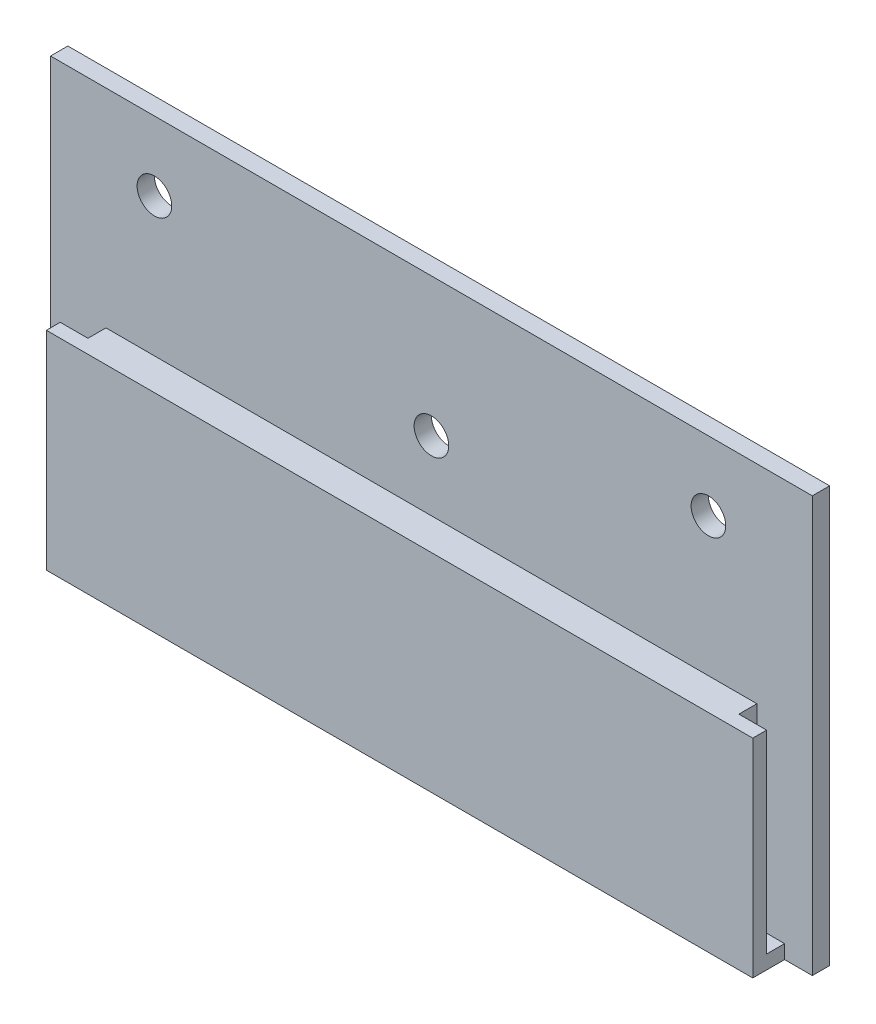
ISO-10303-21;
HEADER;
FILE_DESCRIPTION(('STEP AP214'),'2;1');
FILE_NAME('part.step','',(''),(''),'','','');
FILE_SCHEMA(('AUTOMOTIVE_DESIGN { 1 0 10303 214 1 1 1 1 }'));
ENDSEC;
DATA;
#1=APPLICATION_CONTEXT('core data for automotive mechanical design processes');
#2=APPLICATION_PROTOCOL_DEFINITION('international standard','automotive_design',2000,#1);
#3=PRODUCT_CONTEXT('',#1,'mechanical');
#4=PRODUCT('Part','Part','',(#3));
#5=PRODUCT_RELATED_PRODUCT_CATEGORY('part','',(#4));
#6=PRODUCT_DEFINITION_FORMATION('','',#4);
#7=PRODUCT_DEFINITION_CONTEXT('part definition',#1,'design');
#8=PRODUCT_DEFINITION('design','',#6,#7);
#9=PRODUCT_DEFINITION_SHAPE('','',#8);
#10=(LENGTH_UNIT() NAMED_UNIT(*) SI_UNIT(.MILLI.,.METRE.));
#11=(NAMED_UNIT(*) PLANE_ANGLE_UNIT() SI_UNIT($,.RADIAN.));
#12=(NAMED_UNIT(*) SI_UNIT($,.STERADIAN.) SOLID_ANGLE_UNIT());
#13=UNCERTAINTY_MEASURE_WITH_UNIT(LENGTH_MEASURE(1.E-05),#10,'distance_accuracy_value','');
#14=(GEOMETRIC_REPRESENTATION_CONTEXT(3) GLOBAL_UNCERTAINTY_ASSIGNED_CONTEXT((#13)) GLOBAL_UNIT_ASSIGNED_CONTEXT((#10,
#11,#12)) REPRESENTATION_CONTEXT('',''));
#15=CARTESIAN_POINT('',(0.,0.,0.));
#16=DIRECTION('',(0.,0.,1.));
#17=DIRECTION('',(1.,0.,0.));
#18=AXIS2_PLACEMENT_3D('',#15,#16,#17);
#19=CARTESIAN_POINT('',(10.16,-76.2,6.477));
#20=DIRECTION('',(1.,0.,0.));
#21=DIRECTION('',(0.,0.,-1.));
#22=AXIS2_PLACEMENT_3D('',#19,#20,#21);
#23=PLANE('',#22);
#24=DIRECTION('',(0.,0.,-1.));
#25=VECTOR('',#24,1.);
#26=CARTESIAN_POINT('',(10.16,-73.66,6.477));
#27=LINE('',#26,#25);
#28=CARTESIAN_POINT('',(10.16,-73.66,6.477));
#29=VERTEX_POINT('',#28);
#30=CARTESIAN_POINT('',(10.16,-73.66,3.175));
#31=VERTEX_POINT('',#30);
#32=EDGE_CURVE('E254',#29,#31,#27,.T.);
#33=ORIENTED_EDGE('',*,*,#32,.F.);
#34=DIRECTION('',(0.,-1.,0.));
#35=VECTOR('',#34,1.);
#36=CARTESIAN_POINT('',(10.16,-76.2,6.477));
#37=LINE('',#36,#35);
#38=CARTESIAN_POINT('',(10.16,-38.1,6.477));
#39=VERTEX_POINT('',#38);
#40=EDGE_CURVE('E223',#39,#29,#37,.T.);
#41=ORIENTED_EDGE('',*,*,#40,.F.);
#42=DIRECTION('',(0.,0.,-1.));
#43=VECTOR('',#42,1.);
#44=CARTESIAN_POINT('',(10.16,-38.1,6.477));
#45=LINE('',#44,#43);
#46=CARTESIAN_POINT('',(10.16,-38.1,3.175));
#47=VERTEX_POINT('',#46);
#48=EDGE_CURVE('E217',#39,#47,#45,.T.);
#49=ORIENTED_EDGE('',*,*,#48,.T.);
#50=DIRECTION('',(0.,-1.,0.));
#51=VECTOR('',#50,1.);
#52=CARTESIAN_POINT('',(10.16,-76.2,3.175));
#53=LINE('',#52,#51);
#54=EDGE_CURVE('E66',#47,#31,#53,.T.);
#55=ORIENTED_EDGE('',*,*,#54,.T.);
#56=EDGE_LOOP('',(#33,#41,#49,#55));
#57=FACE_BOUND('',#56,.T.);
#58=ADVANCED_FACE('F49',(#57),#23,.F.);
#59=CARTESIAN_POINT('',(129.54,-76.2,6.477));
#60=DIRECTION('',(-1.,0.,0.));
#61=DIRECTION('',(0.,0.,1.));
#62=AXIS2_PLACEMENT_3D('',#59,#60,#61);
#63=PLANE('',#62);
#64=DIRECTION('',(0.,0.,1.));
#65=VECTOR('',#64,1.);
#66=CARTESIAN_POINT('',(129.54,-73.66,6.477));
#67=LINE('',#66,#65);
#68=CARTESIAN_POINT('',(129.54,-73.66,3.175));
#69=VERTEX_POINT('',#68);
#70=CARTESIAN_POINT('',(129.54,-73.66,6.477));
#71=VERTEX_POINT('',#70);
#72=EDGE_CURVE('E260',#69,#71,#67,.T.);
#73=ORIENTED_EDGE('',*,*,#72,.F.);
#74=DIRECTION('',(0.,1.,0.));
#75=VECTOR('',#74,1.);
#76=CARTESIAN_POINT('',(129.54,-76.2,3.175));
#77=LINE('',#76,#75);
#78=CARTESIAN_POINT('',(129.54,-38.1,3.175));
#79=VERTEX_POINT('',#78);
#80=EDGE_CURVE('E224',#69,#79,#77,.T.);
#81=ORIENTED_EDGE('',*,*,#80,.T.);
#82=DIRECTION('',(0.,0.,-1.));
#83=VECTOR('',#82,1.);
#84=CARTESIAN_POINT('',(129.54,-38.1,6.477));
#85=LINE('',#84,#83);
#86=CARTESIAN_POINT('',(129.54,-38.1,6.477));
#87=VERTEX_POINT('',#86);
#88=EDGE_CURVE('E198',#87,#79,#85,.T.);
#89=ORIENTED_EDGE('',*,*,#88,.F.);
#90=DIRECTION('',(0.,1.,0.));
#91=VECTOR('',#90,1.);
#92=CARTESIAN_POINT('',(129.54,-76.2,6.477));
#93=LINE('',#92,#91);
#94=EDGE_CURVE('E220',#71,#87,#93,.T.);
#95=ORIENTED_EDGE('',*,*,#94,.F.);
#96=EDGE_LOOP('',(#73,#81,#89,#95));
#97=FACE_BOUND('',#96,.T.);
#98=ADVANCED_FACE('F321',(#97),#63,.F.);
#99=CARTESIAN_POINT('',(0.,0.,6.477));
#100=DIRECTION('',(0.,0.,1.));
#101=DIRECTION('',(1.,0.,0.));
#102=AXIS2_PLACEMENT_3D('',#99,#100,#101);
#103=PLANE('',#102);
#104=DIRECTION('',(1.,0.,0.));
#105=VECTOR('',#104,1.);
#106=CARTESIAN_POINT('',(0.,-73.66,6.477));
#107=LINE('',#106,#105);
#108=CARTESIAN_POINT('',(5.08,-73.66,6.477));
#109=VERTEX_POINT('',#108);
#110=EDGE_CURVE('E256',#109,#29,#107,.T.);
#111=ORIENTED_EDGE('',*,*,#110,.F.);
#112=DIRECTION('',(0.,-1.,0.));
#113=VECTOR('',#112,1.);
#114=CARTESIAN_POINT('',(5.07999999999999,-38.1,6.477));
#115=LINE('',#114,#113);
#116=CARTESIAN_POINT('',(5.07999999999999,-38.1,6.477));
#117=VERTEX_POINT('',#116);
#118=EDGE_CURVE('E179',#117,#109,#115,.T.);
#119=ORIENTED_EDGE('',*,*,#118,.F.);
#120=DIRECTION('',(-1.,0.,0.));
#121=VECTOR('',#120,1.);
#122=CARTESIAN_POINT('',(5.07999999999999,-38.1,6.477));
#123=LINE('',#122,#121);
#124=EDGE_CURVE('E242',#39,#117,#123,.T.);
#125=ORIENTED_EDGE('',*,*,#124,.F.);
#126=ORIENTED_EDGE('',*,*,#40,.T.);
#127=EDGE_LOOP('',(#111,#119,#125,#126));
#128=FACE_BOUND('',#127,.T.);
#129=ADVANCED_FACE('F328',(#128),#103,.F.);
#130=DIRECTION('',(1.,0.,0.));
#131=VECTOR('',#130,1.);
#132=CARTESIAN_POINT('',(0.,-73.66,6.477));
#133=LINE('',#132,#131);
#134=CARTESIAN_POINT('',(134.62,-73.66,6.477));
#135=VERTEX_POINT('',#134);
#136=EDGE_CURVE('E262',#71,#135,#133,.T.);
#137=ORIENTED_EDGE('',*,*,#136,.F.);
#138=ORIENTED_EDGE('',*,*,#94,.T.);
#139=CARTESIAN_POINT('',(134.62,-38.1,6.477));
#140=VERTEX_POINT('',#139);
#141=EDGE_CURVE('E238',#140,#87,#123,.T.);
#142=ORIENTED_EDGE('',*,*,#141,.F.);
#143=DIRECTION('',(0.,1.,0.));
#144=VECTOR('',#143,1.);
#145=CARTESIAN_POINT('',(134.62,-38.1,6.477));
#146=LINE('',#145,#144);
#147=EDGE_CURVE('E243',#135,#140,#146,.T.);
#148=ORIENTED_EDGE('',*,*,#147,.F.);
#149=EDGE_LOOP('',(#137,#138,#142,#148));
#150=FACE_BOUND('',#149,.T.);
#151=ADVANCED_FACE('F298',(#150),#103,.F.);
#152=CARTESIAN_POINT('',(0.,0.,3.175));
#153=DIRECTION('',(0.,0.,-1.));
#154=DIRECTION('',(-1.,0.,0.));
#155=AXIS2_PLACEMENT_3D('',#152,#153,#154);
#156=PLANE('',#155);
#157=CARTESIAN_POINT('',(19.05,-12.7,3.175));
#158=DIRECTION('',(0.,0.,-1.));
#159=DIRECTION('',(-1.,0.,0.));
#160=AXIS2_PLACEMENT_3D('',#157,#158,#159);
#161=CIRCLE('',#160,3.175);
#162=CARTESIAN_POINT('',(15.875,-12.7,3.175));
#163=VERTEX_POINT('',#162);
#164=EDGE_CURVE('E268',#163,#163,#161,.T.);
#165=ORIENTED_EDGE('',*,*,#164,.T.);
#166=EDGE_LOOP('',(#165));
#167=FACE_BOUND('',#166,.T.);
#168=CARTESIAN_POINT('',(69.85,-25.4,3.175));
#169=DIRECTION('',(0.,0.,-1.));
#170=DIRECTION('',(-1.,0.,0.));
#171=AXIS2_PLACEMENT_3D('',#168,#169,#170);
#172=CIRCLE('',#171,3.175);
#173=CARTESIAN_POINT('',(66.675,-25.4,3.175));
#174=VERTEX_POINT('',#173);
#175=EDGE_CURVE('E271',#174,#174,#172,.T.);
#176=ORIENTED_EDGE('',*,*,#175,.T.);
#177=EDGE_LOOP('',(#176));
#178=FACE_BOUND('',#177,.T.);
#179=CARTESIAN_POINT('',(120.65,-12.7,3.175));
#180=DIRECTION('',(0.,0.,-1.));
#181=DIRECTION('',(-1.,0.,0.));
#182=AXIS2_PLACEMENT_3D('',#179,#180,#181);
#183=CIRCLE('',#182,3.17499999999998);
#184=CARTESIAN_POINT('',(117.475,-12.7,3.175));
#185=VERTEX_POINT('',#184);
#186=EDGE_CURVE('E274',#185,#185,#183,.T.);
#187=ORIENTED_EDGE('',*,*,#186,.T.);
#188=EDGE_LOOP('',(#187));
#189=FACE_BOUND('',#188,.T.);
#190=DIRECTION('',(-1.,0.,0.));
#191=VECTOR('',#190,1.);
#192=CARTESIAN_POINT('',(0.,-73.66,3.175));
#193=LINE('',#192,#191);
#194=CARTESIAN_POINT('',(134.62,-73.66,3.175));
#195=VERTEX_POINT('',#194);
#196=EDGE_CURVE('E258',#195,#69,#193,.T.);
#197=ORIENTED_EDGE('',*,*,#196,.F.);
#198=DIRECTION('',(0.,-1.,0.));
#199=VECTOR('',#198,1.);
#200=CARTESIAN_POINT('',(134.62,0.,3.175));
#201=LINE('',#200,#199);
#202=CARTESIAN_POINT('',(134.62,-76.2,3.175));
#203=VERTEX_POINT('',#202);
#204=EDGE_CURVE('E180',#195,#203,#201,.T.);
#205=ORIENTED_EDGE('',*,*,#204,.T.);
#206=DIRECTION('',(1.,0.,0.));
#207=VECTOR('',#206,1.);
#208=CARTESIAN_POINT('',(0.,-76.2,3.175));
#209=LINE('',#208,#207);
#210=CARTESIAN_POINT('',(139.7,-76.2,3.175));
#211=VERTEX_POINT('',#210);
#212=EDGE_CURVE('E187',#203,#211,#209,.T.);
#213=ORIENTED_EDGE('',*,*,#212,.T.);
#214=DIRECTION('',(0.,-1.,0.));
#215=VECTOR('',#214,1.);
#216=CARTESIAN_POINT('',(139.7,0.,3.175));
#217=LINE('',#216,#215);
#218=CARTESIAN_POINT('',(139.7,0.,3.175));
#219=VERTEX_POINT('',#218);
#220=EDGE_CURVE('E190',#219,#211,#217,.T.);
#221=ORIENTED_EDGE('',*,*,#220,.F.);
#222=DIRECTION('',(1.,0.,0.));
#223=VECTOR('',#222,1.);
#224=CARTESIAN_POINT('',(0.,0.,3.175));
#225=LINE('',#224,#223);
#226=CARTESIAN_POINT('',(0.,0.,3.175));
#227=VERTEX_POINT('',#226);
#228=EDGE_CURVE('E204',#227,#219,#225,.T.);
#229=ORIENTED_EDGE('',*,*,#228,.F.);
#230=DIRECTION('',(0.,-1.,0.));
#231=VECTOR('',#230,1.);
#232=CARTESIAN_POINT('',(0.,0.,3.175));
#233=LINE('',#232,#231);
#234=CARTESIAN_POINT('',(0.,-76.2,3.175));
#235=VERTEX_POINT('',#234);
#236=EDGE_CURVE('E185',#227,#235,#233,.T.);
#237=ORIENTED_EDGE('',*,*,#236,.T.);
#238=CARTESIAN_POINT('',(5.08,-76.2,3.175));
#239=VERTEX_POINT('',#238);
#240=EDGE_CURVE('E166',#235,#239,#209,.T.);
#241=ORIENTED_EDGE('',*,*,#240,.T.);
#242=DIRECTION('',(0.,1.,0.));
#243=VECTOR('',#242,1.);
#244=CARTESIAN_POINT('',(5.08,0.,3.175));
#245=LINE('',#244,#243);
#246=CARTESIAN_POINT('',(5.08,-73.66,3.175));
#247=VERTEX_POINT('',#246);
#248=EDGE_CURVE('E175',#239,#247,#245,.T.);
#249=ORIENTED_EDGE('',*,*,#248,.T.);
#250=EDGE_CURVE('E253',#31,#247,#193,.T.);
#251=ORIENTED_EDGE('',*,*,#250,.F.);
#252=ORIENTED_EDGE('',*,*,#54,.F.);
#253=DIRECTION('',(-1.,0.,0.));
#254=VECTOR('',#253,1.);
#255=CARTESIAN_POINT('',(10.16,-38.1,3.175));
#256=LINE('',#255,#254);
#257=EDGE_CURVE('E221',#79,#47,#256,.T.);
#258=ORIENTED_EDGE('',*,*,#257,.F.);
#259=ORIENTED_EDGE('',*,*,#80,.F.);
#260=EDGE_LOOP('',(#197,#205,#213,#221,#229,#237,#241,#249,#251,#252,#258,#259));
#261=FACE_BOUND('',#260,.T.);
#262=ADVANCED_FACE('F183',(#167,#178,#189,#261),#156,.F.);
#263=CARTESIAN_POINT('',(0.,0.,3.175));
#264=DIRECTION('',(0.,1.,0.));
#265=DIRECTION('',(0.,0.,1.));
#266=AXIS2_PLACEMENT_3D('',#263,#264,#265);
#267=PLANE('',#266);
#268=DIRECTION('',(1.,0.,0.));
#269=VECTOR('',#268,1.);
#270=CARTESIAN_POINT('',(0.,0.,0.));
#271=LINE('',#270,#269);
#272=CARTESIAN_POINT('',(0.,0.,0.));
#273=VERTEX_POINT('',#272);
#274=CARTESIAN_POINT('',(139.7,0.,0.));
#275=VERTEX_POINT('',#274);
#276=EDGE_CURVE('E194',#273,#275,#271,.T.);
#277=ORIENTED_EDGE('',*,*,#276,.F.);
#278=DIRECTION('',(0.,0.,-1.));
#279=VECTOR('',#278,1.);
#280=CARTESIAN_POINT('',(0.,0.,3.175));
#281=LINE('',#280,#279);
#282=EDGE_CURVE('E11',#227,#273,#281,.T.);
#283=ORIENTED_EDGE('',*,*,#282,.F.);
#284=ORIENTED_EDGE('',*,*,#228,.T.);
#285=DIRECTION('',(0.,0.,-1.));
#286=VECTOR('',#285,1.);
#287=CARTESIAN_POINT('',(139.7,0.,3.175));
#288=LINE('',#287,#286);
#289=EDGE_CURVE('E53',#219,#275,#288,.T.);
#290=ORIENTED_EDGE('',*,*,#289,.T.);
#291=EDGE_LOOP('',(#277,#283,#284,#290));
#292=FACE_BOUND('',#291,.T.);
#293=ADVANCED_FACE('F51',(#292),#267,.T.);
#294=CARTESIAN_POINT('',(0.,0.,3.175));
#295=DIRECTION('',(1.,0.,0.));
#296=DIRECTION('',(0.,0.,-1.));
#297=AXIS2_PLACEMENT_3D('',#294,#295,#296);
#298=PLANE('',#297);
#299=DIRECTION('',(0.,-1.,0.));
#300=VECTOR('',#299,1.);
#301=CARTESIAN_POINT('',(0.,0.,0.));
#302=LINE('',#301,#300);
#303=CARTESIAN_POINT('',(0.,-76.2,0.));
#304=VERTEX_POINT('',#303);
#305=EDGE_CURVE('E203',#273,#304,#302,.T.);
#306=ORIENTED_EDGE('',*,*,#305,.T.);
#307=DIRECTION('',(0.,0.,-1.));
#308=VECTOR('',#307,1.);
#309=CARTESIAN_POINT('',(0.,-76.2,3.175));
#310=LINE('',#309,#308);
#311=EDGE_CURVE('E58',#235,#304,#310,.T.);
#312=ORIENTED_EDGE('',*,*,#311,.F.);
#313=ORIENTED_EDGE('',*,*,#236,.F.);
#314=ORIENTED_EDGE('',*,*,#282,.T.);
#315=EDGE_LOOP('',(#306,#312,#313,#314));
#316=FACE_BOUND('',#315,.T.);
#317=ADVANCED_FACE('F213',(#316),#298,.F.);
#318=CARTESIAN_POINT('',(0.,-76.2,3.175));
#319=DIRECTION('',(0.,1.,0.));
#320=DIRECTION('',(0.,0.,1.));
#321=AXIS2_PLACEMENT_3D('',#318,#319,#320);
#322=PLANE('',#321);
#323=ORIENTED_EDGE('',*,*,#212,.F.);
#324=DIRECTION('',(0.,0.,-1.));
#325=VECTOR('',#324,1.);
#326=CARTESIAN_POINT('',(134.62,-76.2,9.017));
#327=LINE('',#326,#325);
#328=CARTESIAN_POINT('',(134.62,-76.2,9.017));
#329=VERTEX_POINT('',#328);
#330=EDGE_CURVE('E171',#329,#203,#327,.T.);
#331=ORIENTED_EDGE('',*,*,#330,.F.);
#332=DIRECTION('',(1.,0.,0.));
#333=VECTOR('',#332,1.);
#334=CARTESIAN_POINT('',(5.08,-76.2,9.017));
#335=LINE('',#334,#333);
#336=CARTESIAN_POINT('',(5.08,-76.2,9.017));
#337=VERTEX_POINT('',#336);
#338=EDGE_CURVE('E168',#337,#329,#335,.T.);
#339=ORIENTED_EDGE('',*,*,#338,.F.);
#340=DIRECTION('',(0.,0.,-1.));
#341=VECTOR('',#340,1.);
#342=CARTESIAN_POINT('',(5.08,-76.2,9.017));
#343=LINE('',#342,#341);
#344=EDGE_CURVE('E160',#337,#239,#343,.T.);
#345=ORIENTED_EDGE('',*,*,#344,.T.);
#346=ORIENTED_EDGE('',*,*,#240,.F.);
#347=ORIENTED_EDGE('',*,*,#311,.T.);
#348=DIRECTION('',(1.,0.,0.));
#349=VECTOR('',#348,1.);
#350=CARTESIAN_POINT('',(0.,-76.2,0.));
#351=LINE('',#350,#349);
#352=CARTESIAN_POINT('',(139.7,-76.2,0.));
#353=VERTEX_POINT('',#352);
#354=EDGE_CURVE('E201',#304,#353,#351,.T.);
#355=ORIENTED_EDGE('',*,*,#354,.T.);
#356=DIRECTION('',(0.,0.,-1.));
#357=VECTOR('',#356,1.);
#358=CARTESIAN_POINT('',(139.7,-76.2,3.175));
#359=LINE('',#358,#357);
#360=EDGE_CURVE('E206',#211,#353,#359,.T.);
#361=ORIENTED_EDGE('',*,*,#360,.F.);
#362=EDGE_LOOP('',(#323,#331,#339,#345,#346,#347,#355,#361));
#363=FACE_BOUND('',#362,.T.);
#364=ADVANCED_FACE('F163',(#363),#322,.F.);
#365=CARTESIAN_POINT('',(139.7,0.,3.175));
#366=DIRECTION('',(1.,0.,0.));
#367=DIRECTION('',(0.,0.,-1.));
#368=AXIS2_PLACEMENT_3D('',#365,#366,#367);
#369=PLANE('',#368);
#370=DIRECTION('',(0.,-1.,0.));
#371=VECTOR('',#370,1.);
#372=CARTESIAN_POINT('',(139.7,0.,0.));
#373=LINE('',#372,#371);
#374=EDGE_CURVE('E197',#275,#353,#373,.T.);
#375=ORIENTED_EDGE('',*,*,#374,.F.);
#376=ORIENTED_EDGE('',*,*,#289,.F.);
#377=ORIENTED_EDGE('',*,*,#220,.T.);
#378=ORIENTED_EDGE('',*,*,#360,.T.);
#379=EDGE_LOOP('',(#375,#376,#377,#378));
#380=FACE_BOUND('',#379,.T.);
#381=ADVANCED_FACE('F209',(#380),#369,.T.);
#382=CARTESIAN_POINT('',(0.,0.,0.));
#383=DIRECTION('',(0.,0.,-1.));
#384=DIRECTION('',(-1.,0.,0.));
#385=AXIS2_PLACEMENT_3D('',#382,#383,#384);
#386=PLANE('',#385);
#387=CARTESIAN_POINT('',(19.05,-12.7,0.));
#388=DIRECTION('',(0.,0.,1.));
#389=DIRECTION('',(1.,0.,0.));
#390=AXIS2_PLACEMENT_3D('',#387,#388,#389);
#391=CIRCLE('',#390,3.175);
#392=CARTESIAN_POINT('',(22.225,-12.7,0.));
#393=VERTEX_POINT('',#392);
#394=EDGE_CURVE('E277',#393,#393,#391,.T.);
#395=ORIENTED_EDGE('',*,*,#394,.T.);
#396=EDGE_LOOP('',(#395));
#397=FACE_BOUND('',#396,.T.);
#398=CARTESIAN_POINT('',(69.85,-25.4,0.));
#399=DIRECTION('',(0.,0.,1.));
#400=DIRECTION('',(1.,0.,0.));
#401=AXIS2_PLACEMENT_3D('',#398,#399,#400);
#402=CIRCLE('',#401,3.175);
#403=CARTESIAN_POINT('',(73.025,-25.4,0.));
#404=VERTEX_POINT('',#403);
#405=EDGE_CURVE('E281',#404,#404,#402,.T.);
#406=ORIENTED_EDGE('',*,*,#405,.T.);
#407=EDGE_LOOP('',(#406));
#408=FACE_BOUND('',#407,.T.);
#409=CARTESIAN_POINT('',(120.65,-12.7,0.));
#410=DIRECTION('',(0.,0.,1.));
#411=DIRECTION('',(1.,0.,0.));
#412=AXIS2_PLACEMENT_3D('',#409,#410,#411);
#413=CIRCLE('',#412,3.17499999999998);
#414=CARTESIAN_POINT('',(123.825,-12.7,0.));
#415=VERTEX_POINT('',#414);
#416=EDGE_CURVE('E278',#415,#415,#413,.T.);
#417=ORIENTED_EDGE('',*,*,#416,.T.);
#418=EDGE_LOOP('',(#417));
#419=FACE_BOUND('',#418,.T.);
#420=ORIENTED_EDGE('',*,*,#374,.T.);
#421=ORIENTED_EDGE('',*,*,#354,.F.);
#422=ORIENTED_EDGE('',*,*,#305,.F.);
#423=ORIENTED_EDGE('',*,*,#276,.T.);
#424=EDGE_LOOP('',(#420,#421,#422,#423));
#425=FACE_BOUND('',#424,.T.);
#426=ADVANCED_FACE('F212',(#397,#408,#419,#425),#386,.T.);
#427=CARTESIAN_POINT('',(10.16,-38.1,6.477));
#428=DIRECTION('',(0.,-1.,0.));
#429=DIRECTION('',(0.,0.,-1.));
#430=AXIS2_PLACEMENT_3D('',#427,#428,#429);
#431=PLANE('',#430);
#432=ORIENTED_EDGE('',*,*,#257,.T.);
#433=ORIENTED_EDGE('',*,*,#48,.F.);
#434=ORIENTED_EDGE('',*,*,#124,.T.);
#435=DIRECTION('',(0.,0.,-1.));
#436=VECTOR('',#435,1.);
#437=CARTESIAN_POINT('',(5.07999999999999,-38.1,9.017));
#438=LINE('',#437,#436);
#439=CARTESIAN_POINT('',(5.07999999999999,-38.1,9.017));
#440=VERTEX_POINT('',#439);
#441=EDGE_CURVE('E234',#440,#117,#438,.T.);
#442=ORIENTED_EDGE('',*,*,#441,.F.);
#443=DIRECTION('',(-1.,0.,0.));
#444=VECTOR('',#443,1.);
#445=CARTESIAN_POINT('',(5.07999999999999,-38.1,9.017));
#446=LINE('',#445,#444);
#447=CARTESIAN_POINT('',(134.62,-38.1,9.017));
#448=VERTEX_POINT('',#447);
#449=EDGE_CURVE('E237',#448,#440,#446,.T.);
#450=ORIENTED_EDGE('',*,*,#449,.F.);
#451=DIRECTION('',(0.,0.,-1.));
#452=VECTOR('',#451,1.);
#453=CARTESIAN_POINT('',(134.62,-38.1,9.017));
#454=LINE('',#453,#452);
#455=EDGE_CURVE('E231',#448,#140,#454,.T.);
#456=ORIENTED_EDGE('',*,*,#455,.T.);
#457=ORIENTED_EDGE('',*,*,#141,.T.);
#458=ORIENTED_EDGE('',*,*,#88,.T.);
#459=EDGE_LOOP('',(#432,#433,#434,#442,#450,#456,#457,#458));
#460=FACE_BOUND('',#459,.T.);
#461=ADVANCED_FACE('F336',(#460),#431,.F.);
#462=CARTESIAN_POINT('',(5.07999999999999,-38.1,9.017));
#463=DIRECTION('',(1.,0.,0.));
#464=DIRECTION('',(0.,1.,0.));
#465=AXIS2_PLACEMENT_3D('',#462,#463,#464);
#466=PLANE('',#465);
#467=ORIENTED_EDGE('',*,*,#344,.F.);
#468=DIRECTION('',(0.,-1.,0.));
#469=VECTOR('',#468,1.);
#470=CARTESIAN_POINT('',(5.07999999999999,-38.1,9.017));
#471=LINE('',#470,#469);
#472=EDGE_CURVE('E241',#440,#337,#471,.T.);
#473=ORIENTED_EDGE('',*,*,#472,.F.);
#474=ORIENTED_EDGE('',*,*,#441,.T.);
#475=ORIENTED_EDGE('',*,*,#118,.T.);
#476=DIRECTION('',(0.,0.,-1.));
#477=VECTOR('',#476,1.);
#478=CARTESIAN_POINT('',(5.08,-73.66,9.017));
#479=LINE('',#478,#477);
#480=EDGE_CURVE('E178',#109,#247,#479,.T.);
#481=ORIENTED_EDGE('',*,*,#480,.T.);
#482=ORIENTED_EDGE('',*,*,#248,.F.);
#483=EDGE_LOOP('',(#467,#473,#474,#475,#481,#482));
#484=FACE_BOUND('',#483,.T.);
#485=ADVANCED_FACE('F176',(#484),#466,.F.);
#486=CARTESIAN_POINT('',(134.62,-38.1,9.017));
#487=DIRECTION('',(-1.,0.,0.));
#488=DIRECTION('',(0.,0.,1.));
#489=AXIS2_PLACEMENT_3D('',#486,#487,#488);
#490=PLANE('',#489);
#491=ORIENTED_EDGE('',*,*,#330,.T.);
#492=ORIENTED_EDGE('',*,*,#204,.F.);
#493=DIRECTION('',(0.,0.,1.));
#494=VECTOR('',#493,1.);
#495=CARTESIAN_POINT('',(134.62,-73.66,9.017));
#496=LINE('',#495,#494);
#497=EDGE_CURVE('E264',#195,#135,#496,.T.);
#498=ORIENTED_EDGE('',*,*,#497,.T.);
#499=ORIENTED_EDGE('',*,*,#147,.T.);
#500=ORIENTED_EDGE('',*,*,#455,.F.);
#501=DIRECTION('',(0.,1.,0.));
#502=VECTOR('',#501,1.);
#503=CARTESIAN_POINT('',(134.62,-38.1,9.017));
#504=LINE('',#503,#502);
#505=EDGE_CURVE('E247',#329,#448,#504,.T.);
#506=ORIENTED_EDGE('',*,*,#505,.F.);
#507=EDGE_LOOP('',(#491,#492,#498,#499,#500,#506));
#508=FACE_BOUND('',#507,.T.);
#509=ADVANCED_FACE('F383',(#508),#490,.F.);
#510=CARTESIAN_POINT('',(0.,0.,9.017));
#511=DIRECTION('',(0.,0.,1.));
#512=DIRECTION('',(1.,0.,0.));
#513=AXIS2_PLACEMENT_3D('',#510,#511,#512);
#514=PLANE('',#513);
#515=ORIENTED_EDGE('',*,*,#505,.T.);
#516=ORIENTED_EDGE('',*,*,#449,.T.);
#517=ORIENTED_EDGE('',*,*,#472,.T.);
#518=ORIENTED_EDGE('',*,*,#338,.T.);
#519=EDGE_LOOP('',(#515,#516,#517,#518));
#520=FACE_BOUND('',#519,.T.);
#521=ADVANCED_FACE('F374',(#520),#514,.T.);
#522=CARTESIAN_POINT('',(0.,-73.66,0.));
#523=DIRECTION('',(0.,-1.,0.));
#524=DIRECTION('',(0.,0.,-1.));
#525=AXIS2_PLACEMENT_3D('',#522,#523,#524);
#526=PLANE('',#525);
#527=ORIENTED_EDGE('',*,*,#497,.F.);
#528=ORIENTED_EDGE('',*,*,#196,.T.);
#529=ORIENTED_EDGE('',*,*,#72,.T.);
#530=ORIENTED_EDGE('',*,*,#136,.T.);
#531=EDGE_LOOP('',(#527,#528,#529,#530));
#532=FACE_BOUND('',#531,.T.);
#533=ADVANCED_FACE('F316',(#532),#526,.F.);
#534=ORIENTED_EDGE('',*,*,#32,.T.);
#535=ORIENTED_EDGE('',*,*,#250,.T.);
#536=ORIENTED_EDGE('',*,*,#480,.F.);
#537=ORIENTED_EDGE('',*,*,#110,.T.);
#538=EDGE_LOOP('',(#534,#535,#536,#537));
#539=FACE_BOUND('',#538,.T.);
#540=ADVANCED_FACE('F306',(#539),#526,.F.);
#541=CARTESIAN_POINT('',(120.65,-12.7,0.));
#542=DIRECTION('',(0.,0.,1.));
#543=DIRECTION('',(1.,0.,0.));
#544=AXIS2_PLACEMENT_3D('',#541,#542,#543);
#545=CYLINDRICAL_SURFACE('',#544,3.17499999999998);
#546=ORIENTED_EDGE('',*,*,#416,.F.);
#547=EDGE_LOOP('',(#546));
#548=FACE_BOUND('',#547,.T.);
#549=ORIENTED_EDGE('',*,*,#186,.F.);
#550=EDGE_LOOP('',(#549));
#551=FACE_BOUND('',#550,.T.);
#552=ADVANCED_FACE('F304',(#548,#551),#545,.F.);
#553=CARTESIAN_POINT('',(69.85,-25.4,0.));
#554=DIRECTION('',(0.,0.,1.));
#555=DIRECTION('',(1.,0.,0.));
#556=AXIS2_PLACEMENT_3D('',#553,#554,#555);
#557=CYLINDRICAL_SURFACE('',#556,3.175);
#558=ORIENTED_EDGE('',*,*,#405,.F.);
#559=EDGE_LOOP('',(#558));
#560=FACE_BOUND('',#559,.T.);
#561=ORIENTED_EDGE('',*,*,#175,.F.);
#562=EDGE_LOOP('',(#561));
#563=FACE_BOUND('',#562,.T.);
#564=ADVANCED_FACE('F292',(#560,#563),#557,.F.);
#565=CARTESIAN_POINT('',(19.05,-12.7,0.));
#566=DIRECTION('',(0.,0.,1.));
#567=DIRECTION('',(1.,0.,0.));
#568=AXIS2_PLACEMENT_3D('',#565,#566,#567);
#569=CYLINDRICAL_SURFACE('',#568,3.175);
#570=ORIENTED_EDGE('',*,*,#394,.F.);
#571=EDGE_LOOP('',(#570));
#572=FACE_BOUND('',#571,.T.);
#573=ORIENTED_EDGE('',*,*,#164,.F.);
#574=EDGE_LOOP('',(#573));
#575=FACE_BOUND('',#574,.T.);
#576=ADVANCED_FACE('F289',(#572,#575),#569,.F.);
#577=CLOSED_SHELL('',(#58,#98,#129,#151,#262,#293,#317,#364,#381,#426,#461,#485,#509,#521,#533,
#540,#552,#564,#576));
#578=MANIFOLD_SOLID_BREP('B2',#577);
#579=ADVANCED_BREP_SHAPE_REPRESENTATION('',(#18,#578),#14);
#580=SHAPE_DEFINITION_REPRESENTATION(#9,#579);
ENDSEC;
END-ISO-10303-21;
